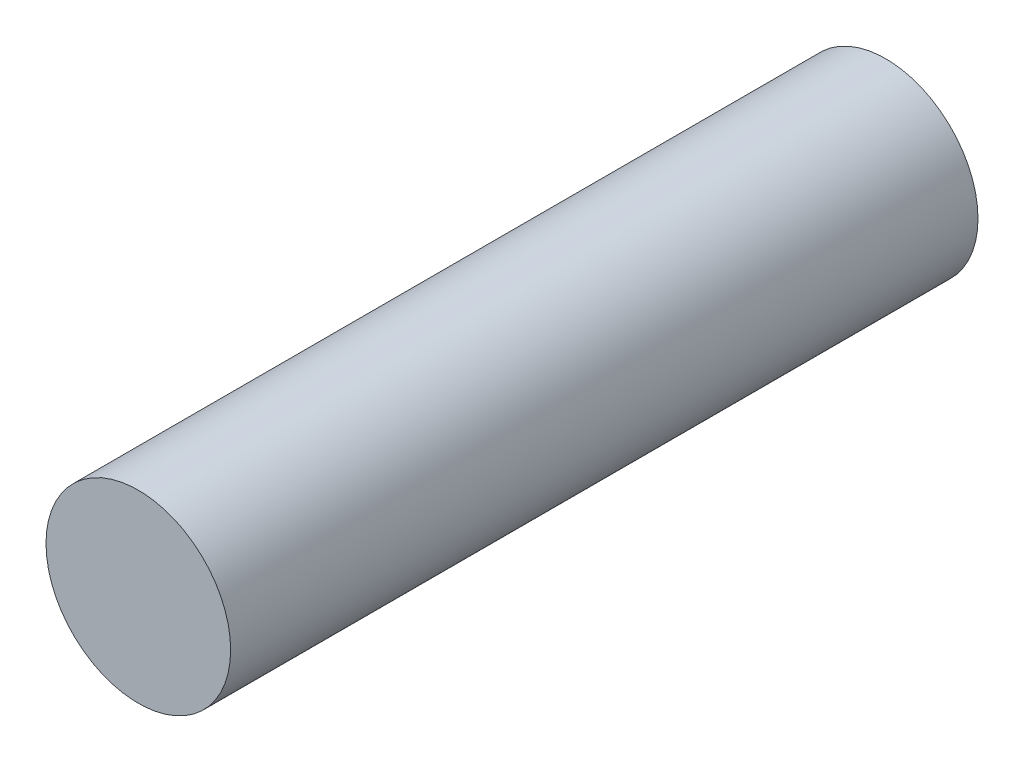
ISO-10303-21;
HEADER;
FILE_DESCRIPTION(('STEP AP214'),'2;1');
FILE_NAME('part.step','',(''),(''),'','','');
FILE_SCHEMA(('AUTOMOTIVE_DESIGN { 1 0 10303 214 1 1 1 1 }'));
ENDSEC;
DATA;
#1=APPLICATION_CONTEXT('core data for automotive mechanical design processes');
#2=APPLICATION_PROTOCOL_DEFINITION('international standard','automotive_design',2000,#1);
#3=PRODUCT_CONTEXT('',#1,'mechanical');
#4=PRODUCT('Part','Part','',(#3));
#5=PRODUCT_RELATED_PRODUCT_CATEGORY('part','',(#4));
#6=PRODUCT_DEFINITION_FORMATION('','',#4);
#7=PRODUCT_DEFINITION_CONTEXT('part definition',#1,'design');
#8=PRODUCT_DEFINITION('design','',#6,#7);
#9=PRODUCT_DEFINITION_SHAPE('','',#8);
#10=(LENGTH_UNIT() NAMED_UNIT(*) SI_UNIT(.MILLI.,.METRE.));
#11=(NAMED_UNIT(*) PLANE_ANGLE_UNIT() SI_UNIT($,.RADIAN.));
#12=(NAMED_UNIT(*) SI_UNIT($,.STERADIAN.) SOLID_ANGLE_UNIT());
#13=UNCERTAINTY_MEASURE_WITH_UNIT(LENGTH_MEASURE(1.E-05),#10,'distance_accuracy_value','');
#14=(GEOMETRIC_REPRESENTATION_CONTEXT(3) GLOBAL_UNCERTAINTY_ASSIGNED_CONTEXT((#13)) GLOBAL_UNIT_ASSIGNED_CONTEXT((#10,
#11,#12)) REPRESENTATION_CONTEXT('',''));
#15=CARTESIAN_POINT('',(0.,0.,0.));
#16=DIRECTION('',(0.,0.,1.));
#17=DIRECTION('',(1.,0.,0.));
#18=AXIS2_PLACEMENT_3D('',#15,#16,#17);
#19=CARTESIAN_POINT('',(0.,0.,40.475));
#20=DIRECTION('',(0.,0.,-1.));
#21=DIRECTION('',(-1.,0.,0.));
#22=AXIS2_PLACEMENT_3D('',#19,#20,#21);
#23=CYLINDRICAL_SURFACE('',#22,5.);
#24=CARTESIAN_POINT('',(0.,0.,40.475));
#25=DIRECTION('',(0.,0.,1.));
#26=DIRECTION('',(1.,0.,0.));
#27=AXIS2_PLACEMENT_3D('',#24,#25,#26);
#28=CIRCLE('',#27,5.);
#29=CARTESIAN_POINT('',(5.,0.,40.475));
#30=VERTEX_POINT('',#29);
#31=EDGE_CURVE('E10',#30,#30,#28,.T.);
#32=ORIENTED_EDGE('',*,*,#31,.F.);
#33=EDGE_LOOP('',(#32));
#34=FACE_BOUND('',#33,.T.);
#35=CARTESIAN_POINT('',(0.,0.,0.));
#36=DIRECTION('',(0.,0.,1.));
#37=DIRECTION('',(1.,0.,0.));
#38=AXIS2_PLACEMENT_3D('',#35,#36,#37);
#39=CIRCLE('',#38,5.);
#40=CARTESIAN_POINT('',(5.,0.,0.));
#41=VERTEX_POINT('',#40);
#42=EDGE_CURVE('E44',#41,#41,#39,.T.);
#43=ORIENTED_EDGE('',*,*,#42,.T.);
#44=EDGE_LOOP('',(#43));
#45=FACE_BOUND('',#44,.T.);
#46=ADVANCED_FACE('F41',(#34,#45),#23,.T.);
#47=CARTESIAN_POINT('',(0.,0.,40.475));
#48=DIRECTION('',(0.,0.,1.));
#49=DIRECTION('',(1.,0.,0.));
#50=AXIS2_PLACEMENT_3D('',#47,#48,#49);
#51=PLANE('',#50);
#52=ORIENTED_EDGE('',*,*,#31,.T.);
#53=EDGE_LOOP('',(#52));
#54=FACE_BOUND('',#53,.T.);
#55=ADVANCED_FACE('F58',(#54),#51,.T.);
#56=CARTESIAN_POINT('',(0.,0.,0.));
#57=DIRECTION('',(0.,0.,1.));
#58=DIRECTION('',(1.,0.,0.));
#59=AXIS2_PLACEMENT_3D('',#56,#57,#58);
#60=PLANE('',#59);
#61=ORIENTED_EDGE('',*,*,#42,.F.);
#62=EDGE_LOOP('',(#61));
#63=FACE_BOUND('',#62,.T.);
#64=ADVANCED_FACE('F56',(#63),#60,.F.);
#65=CLOSED_SHELL('',(#46,#55,#64));
#66=MANIFOLD_SOLID_BREP('B2',#65);
#67=ADVANCED_BREP_SHAPE_REPRESENTATION('',(#18,#66),#14);
#68=SHAPE_DEFINITION_REPRESENTATION(#9,#67);
ENDSEC;
END-ISO-10303-21;
